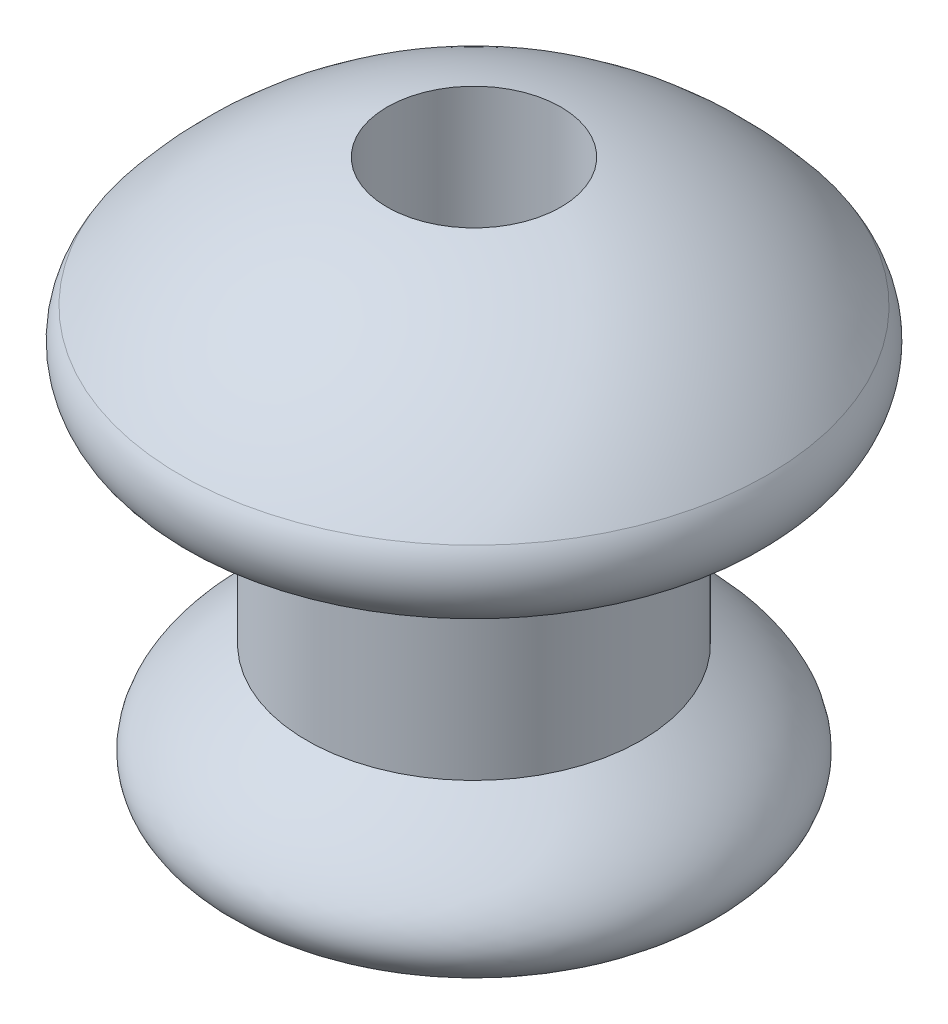
ISO-10303-21;
HEADER;
FILE_DESCRIPTION(('STEP AP214'),'2;1');
FILE_NAME('part.step','',(''),(''),'','','');
FILE_SCHEMA(('AUTOMOTIVE_DESIGN { 1 0 10303 214 1 1 1 1 }'));
ENDSEC;
DATA;
#1=APPLICATION_CONTEXT('core data for automotive mechanical design processes');
#2=APPLICATION_PROTOCOL_DEFINITION('international standard','automotive_design',2000,#1);
#3=PRODUCT_CONTEXT('',#1,'mechanical');
#4=PRODUCT('Part','Part','',(#3));
#5=PRODUCT_RELATED_PRODUCT_CATEGORY('part','',(#4));
#6=PRODUCT_DEFINITION_FORMATION('','',#4);
#7=PRODUCT_DEFINITION_CONTEXT('part definition',#1,'design');
#8=PRODUCT_DEFINITION('design','',#6,#7);
#9=PRODUCT_DEFINITION_SHAPE('','',#8);
#10=(LENGTH_UNIT() NAMED_UNIT(*) SI_UNIT(.MILLI.,.METRE.));
#11=(NAMED_UNIT(*) PLANE_ANGLE_UNIT() SI_UNIT($,.RADIAN.));
#12=(NAMED_UNIT(*) SI_UNIT($,.STERADIAN.) SOLID_ANGLE_UNIT());
#13=UNCERTAINTY_MEASURE_WITH_UNIT(LENGTH_MEASURE(1.E-05),#10,'distance_accuracy_value','');
#14=(GEOMETRIC_REPRESENTATION_CONTEXT(3) GLOBAL_UNCERTAINTY_ASSIGNED_CONTEXT((#13)) GLOBAL_UNIT_ASSIGNED_CONTEXT((#10,
#11,#12)) REPRESENTATION_CONTEXT('',''));
#15=CARTESIAN_POINT('',(0.,0.,0.));
#16=DIRECTION('',(0.,0.,1.));
#17=DIRECTION('',(1.,0.,0.));
#18=AXIS2_PLACEMENT_3D('',#15,#16,#17);
#19=CARTESIAN_POINT('',(-0.0246690593247686,-3.47098229397228,0.));
#20=DIRECTION('',(0.,1.,0.));
#21=DIRECTION('',(-1.,0.,0.));
#22=AXIS2_PLACEMENT_3D('',#19,#20,#21);
#23=DEGENERATE_TOROIDAL_SURFACE('',#22,0.0750108123259072,4.24243475324604,.T.);
#24=CARTESIAN_POINT('',(-0.024669059324769,0.669385761917903,0.));
#25=DIRECTION('',(0.,-1.,0.));
#26=DIRECTION('',(1.,0.,0.));
#27=AXIS2_PLACEMENT_3D('',#24,#25,#26);
#28=CIRCLE('',#27,1.);
#29=CARTESIAN_POINT('',(0.975330940675231,0.669385761917903,0.));
#30=VERTEX_POINT('',#29);
#31=EDGE_CURVE('E38',#30,#30,#28,.F.);
#32=ORIENTED_EDGE('',*,*,#31,.F.);
#33=EDGE_LOOP('',(#32));
#34=FACE_BOUND('',#33,.T.);
#35=CARTESIAN_POINT('',(-0.0246690593247688,-0.812310458067777,0.));
#36=DIRECTION('',(0.,1.,0.));
#37=DIRECTION('',(-1.,0.,0.));
#38=AXIS2_PLACEMENT_3D('',#35,#36,#37);
#39=CIRCLE('',#38,3.38102301806835);
#40=CARTESIAN_POINT('',(-3.40569207739312,-0.812310458067777,0.));
#41=VERTEX_POINT('',#40);
#42=EDGE_CURVE('E51',#41,#41,#39,.T.);
#43=ORIENTED_EDGE('',*,*,#42,.T.);
#44=EDGE_LOOP('',(#43));
#45=FACE_BOUND('',#44,.T.);
#46=ADVANCED_FACE('F33',(#34,#45),#23,.T.);
#47=CARTESIAN_POINT('',(1.90146974711775,-4.18789083274121,0.));
#48=CARTESIAN_POINT('',(3.99780339277794,-5.50535285109693,0.));
#49=CARTESIAN_POINT('',(2.40138714966272,-6.00367518527237,0.));
#50=CARTESIAN_POINT('',(0.316595481163095,-6.15804567850246,0.));
#51=B_SPLINE_CURVE_WITH_KNOTS('',3,(#47,#48,#49,#50),.UNSPECIFIED.,.F.,.F.,(4,4),(0.,1.),.UNSPECIFIED.);
#52=CARTESIAN_POINT('',(-0.0246690593247689,-4.14544838699157E-05,0.));
#53=DIRECTION('',(0.,1.,0.));
#54=AXIS1_PLACEMENT('',#52,#53);
#55=SURFACE_OF_REVOLUTION('',#51,#54);
#56=CARTESIAN_POINT('',(-0.0246690593247683,-6.09486532054408,0.));
#57=DIRECTION('',(0.,1.,0.));
#58=DIRECTION('',(-1.,0.,0.));
#59=AXIS2_PLACEMENT_3D('',#56,#57,#58);
#60=CIRCLE('',#59,1.);
#61=CARTESIAN_POINT('',(-1.02466905932477,-6.09486532054408,0.));
#62=VERTEX_POINT('',#61);
#63=EDGE_CURVE('E53',#62,#62,#60,.F.);
#64=ORIENTED_EDGE('',*,*,#63,.F.);
#65=EDGE_LOOP('',(#64));
#66=FACE_BOUND('',#65,.T.);
#67=CARTESIAN_POINT('',(-0.0246690593247685,-4.18789083274121,0.));
#68=DIRECTION('',(0.,1.,0.));
#69=DIRECTION('',(-1.,0.,0.));
#70=AXIS2_PLACEMENT_3D('',#67,#68,#69);
#71=CIRCLE('',#70,1.92613880644252);
#72=CARTESIAN_POINT('',(-1.95080786576729,-4.18789083274121,0.));
#73=VERTEX_POINT('',#72);
#74=EDGE_CURVE('E10',#73,#73,#71,.T.);
#75=ORIENTED_EDGE('',*,*,#74,.F.);
#76=EDGE_LOOP('',(#75));
#77=FACE_BOUND('',#76,.T.);
#78=ADVANCED_FACE('F35',(#66,#77),#55,.F.);
#79=CARTESIAN_POINT('',(-0.0246690593247689,-4.14544838699157E-05,0.));
#80=DIRECTION('',(0.,1.,0.));
#81=DIRECTION('',(-1.,0.,0.));
#82=AXIS2_PLACEMENT_3D('',#79,#80,#81);
#83=CYLINDRICAL_SURFACE('',#82,1.92613880644252);
#84=CARTESIAN_POINT('',(-0.0246690593247688,-1.60693404743462,0.));
#85=DIRECTION('',(0.,1.,0.));
#86=DIRECTION('',(-1.,0.,0.));
#87=AXIS2_PLACEMENT_3D('',#84,#85,#86);
#88=CIRCLE('',#87,1.92613880644252);
#89=CARTESIAN_POINT('',(-1.95080786576729,-1.60693404743462,0.));
#90=VERTEX_POINT('',#89);
#91=EDGE_CURVE('E42',#90,#90,#88,.T.);
#92=ORIENTED_EDGE('',*,*,#91,.F.);
#93=EDGE_LOOP('',(#92));
#94=FACE_BOUND('',#93,.T.);
#95=ORIENTED_EDGE('',*,*,#74,.T.);
#96=EDGE_LOOP('',(#95));
#97=FACE_BOUND('',#96,.T.);
#98=ADVANCED_FACE('F84',(#94,#97),#83,.T.);
#99=CARTESIAN_POINT('',(0.,-1.60693404743462,0.));
#100=DIRECTION('',(0.,1.,0.));
#101=DIRECTION('',(-1.,0.,0.));
#102=AXIS2_PLACEMENT_3D('',#99,#100,#101);
#103=PLANE('',#102);
#104=CARTESIAN_POINT('',(-0.0246690593247688,-1.60693404743462,0.));
#105=DIRECTION('',(0.,1.,0.));
#106=DIRECTION('',(-1.,0.,0.));
#107=AXIS2_PLACEMENT_3D('',#104,#105,#106);
#108=CIRCLE('',#107,3.29550419741783);
#109=CARTESIAN_POINT('',(-3.3201732567426,-1.60693404743462,0.));
#110=VERTEX_POINT('',#109);
#111=EDGE_CURVE('E46',#110,#110,#108,.T.);
#112=ORIENTED_EDGE('',*,*,#111,.F.);
#113=EDGE_LOOP('',(#112));
#114=FACE_BOUND('',#113,.T.);
#115=ORIENTED_EDGE('',*,*,#91,.T.);
#116=EDGE_LOOP('',(#115));
#117=FACE_BOUND('',#116,.T.);
#118=ADVANCED_FACE('F76',(#114,#117),#103,.F.);
#119=CARTESIAN_POINT('',(-0.0246690593247688,-1.15813640522021,0.));
#120=DIRECTION('',(0.,1.,0.));
#121=DIRECTION('',(-1.,0.,0.));
#122=AXIS2_PLACEMENT_3D('',#119,#120,#121);
#123=TOROIDAL_SURFACE('',#122,2.8598675230513,0.625458740214205);
#124=ORIENTED_EDGE('',*,*,#111,.T.);
#125=EDGE_LOOP('',(#124));
#126=FACE_BOUND('',#125,.T.);
#127=ORIENTED_EDGE('',*,*,#42,.F.);
#128=EDGE_LOOP('',(#127));
#129=FACE_BOUND('',#128,.T.);
#130=ADVANCED_FACE('F74',(#126,#129),#123,.T.);
#131=CARTESIAN_POINT('',(-0.024669059324769,0.771452459273765,0.));
#132=DIRECTION('',(0.,-1.,0.));
#133=DIRECTION('',(1.,0.,0.));
#134=AXIS2_PLACEMENT_3D('',#131,#132,#133);
#135=CYLINDRICAL_SURFACE('',#134,1.);
#136=ORIENTED_EDGE('',*,*,#63,.T.);
#137=EDGE_LOOP('',(#136));
#138=FACE_BOUND('',#137,.T.);
#139=ORIENTED_EDGE('',*,*,#31,.T.);
#140=EDGE_LOOP('',(#139));
#141=FACE_BOUND('',#140,.T.);
#142=ADVANCED_FACE('F67',(#138,#141),#135,.F.);
#143=CLOSED_SHELL('',(#46,#78,#98,#118,#130,#142));
#144=MANIFOLD_SOLID_BREP('B2',#143);
#145=ADVANCED_BREP_SHAPE_REPRESENTATION('',(#18,#144),#14);
#146=SHAPE_DEFINITION_REPRESENTATION(#9,#145);
ENDSEC;
END-ISO-10303-21;
